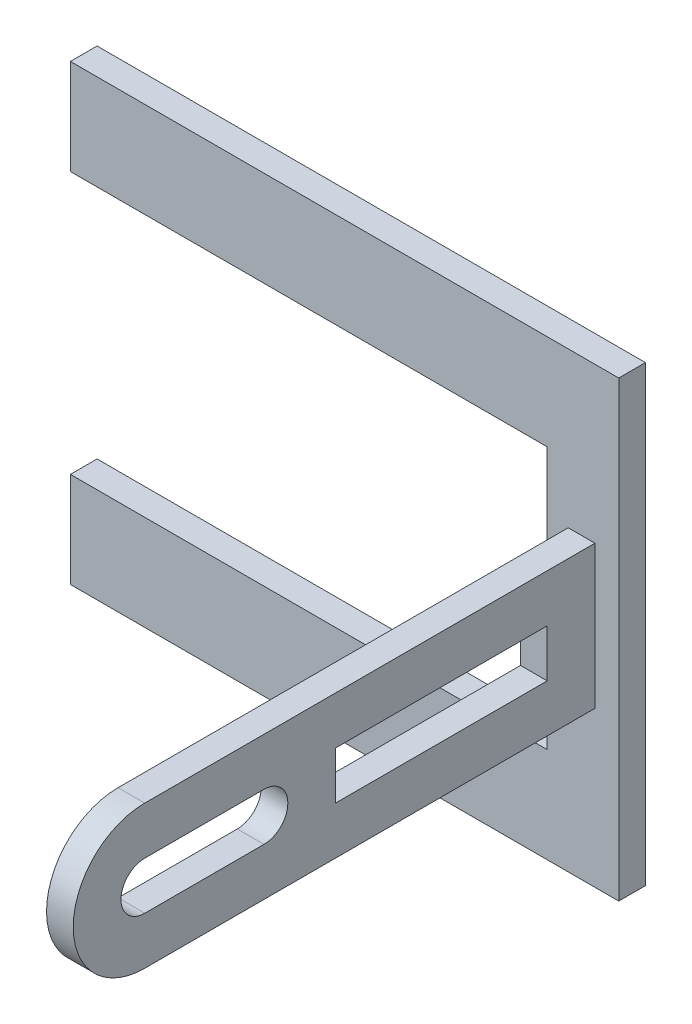
ISO-10303-21;
HEADER;
FILE_DESCRIPTION(('STEP AP214'),'2;1');
FILE_NAME('part.step','',(''),(''),'','','');
FILE_SCHEMA(('AUTOMOTIVE_DESIGN { 1 0 10303 214 1 1 1 1 }'));
ENDSEC;
DATA;
#1=APPLICATION_CONTEXT('core data for automotive mechanical design processes');
#2=APPLICATION_PROTOCOL_DEFINITION('international standard','automotive_design',2000,#1);
#3=PRODUCT_CONTEXT('',#1,'mechanical');
#4=PRODUCT('Part','Part','',(#3));
#5=PRODUCT_RELATED_PRODUCT_CATEGORY('part','',(#4));
#6=PRODUCT_DEFINITION_FORMATION('','',#4);
#7=PRODUCT_DEFINITION_CONTEXT('part definition',#1,'design');
#8=PRODUCT_DEFINITION('design','',#6,#7);
#9=PRODUCT_DEFINITION_SHAPE('','',#8);
#10=(LENGTH_UNIT() NAMED_UNIT(*) SI_UNIT(.MILLI.,.METRE.));
#11=(NAMED_UNIT(*) PLANE_ANGLE_UNIT() SI_UNIT($,.RADIAN.));
#12=(NAMED_UNIT(*) SI_UNIT($,.STERADIAN.) SOLID_ANGLE_UNIT());
#13=UNCERTAINTY_MEASURE_WITH_UNIT(LENGTH_MEASURE(1.E-05),#10,'distance_accuracy_value','');
#14=(GEOMETRIC_REPRESENTATION_CONTEXT(3) GLOBAL_UNCERTAINTY_ASSIGNED_CONTEXT((#13)) GLOBAL_UNIT_ASSIGNED_CONTEXT((#10,
#11,#12)) REPRESENTATION_CONTEXT('',''));
#15=CARTESIAN_POINT('',(0.,0.,0.));
#16=DIRECTION('',(0.,0.,1.));
#17=DIRECTION('',(1.,0.,0.));
#18=AXIS2_PLACEMENT_3D('',#15,#16,#17);
#19=CARTESIAN_POINT('',(0.,0.,2.8));
#20=DIRECTION('',(0.,0.,-1.));
#21=DIRECTION('',(-1.,0.,0.));
#22=AXIS2_PLACEMENT_3D('',#19,#20,#21);
#23=PLANE('',#22);
#24=DIRECTION('',(0.,-1.,0.));
#25=VECTOR('',#24,1.);
#26=CARTESIAN_POINT('',(-25.,-23.75,2.8));
#27=LINE('',#26,#25);
#28=CARTESIAN_POINT('',(-25.,-13.75,2.8));
#29=VERTEX_POINT('',#28);
#30=CARTESIAN_POINT('',(-25.,-23.75,2.8));
#31=VERTEX_POINT('',#30);
#32=EDGE_CURVE('E157',#29,#31,#27,.T.);
#33=ORIENTED_EDGE('',*,*,#32,.T.);
#34=DIRECTION('',(1.,0.,0.));
#35=VECTOR('',#34,1.);
#36=CARTESIAN_POINT('',(32.5,-23.75,2.8));
#37=LINE('',#36,#35);
#38=CARTESIAN_POINT('',(32.5,-23.75,2.8));
#39=VERTEX_POINT('',#38);
#40=EDGE_CURVE('E98',#31,#39,#37,.T.);
#41=ORIENTED_EDGE('',*,*,#40,.T.);
#42=DIRECTION('',(0.,1.,0.));
#43=VECTOR('',#42,1.);
#44=CARTESIAN_POINT('',(32.5,23.75,2.8));
#45=LINE('',#44,#43);
#46=CARTESIAN_POINT('',(32.5,23.75,2.8));
#47=VERTEX_POINT('',#46);
#48=EDGE_CURVE('E172',#39,#47,#45,.T.);
#49=ORIENTED_EDGE('',*,*,#48,.T.);
#50=DIRECTION('',(-1.,0.,0.));
#51=VECTOR('',#50,1.);
#52=CARTESIAN_POINT('',(-25.,23.75,2.8));
#53=LINE('',#52,#51);
#54=CARTESIAN_POINT('',(-25.,23.75,2.8));
#55=VERTEX_POINT('',#54);
#56=EDGE_CURVE('E184',#47,#55,#53,.T.);
#57=ORIENTED_EDGE('',*,*,#56,.T.);
#58=DIRECTION('',(0.,-1.,0.));
#59=VECTOR('',#58,1.);
#60=CARTESIAN_POINT('',(-25.,13.75,2.8));
#61=LINE('',#60,#59);
#62=CARTESIAN_POINT('',(-25.,13.75,2.8));
#63=VERTEX_POINT('',#62);
#64=EDGE_CURVE('E120',#55,#63,#61,.T.);
#65=ORIENTED_EDGE('',*,*,#64,.T.);
#66=DIRECTION('',(1.,0.,0.));
#67=VECTOR('',#66,1.);
#68=CARTESIAN_POINT('',(25.,13.75,2.8));
#69=LINE('',#68,#67);
#70=CARTESIAN_POINT('',(25.,13.75,2.8));
#71=VERTEX_POINT('',#70);
#72=EDGE_CURVE('E113',#63,#71,#69,.T.);
#73=ORIENTED_EDGE('',*,*,#72,.T.);
#74=DIRECTION('',(0.,-1.,0.));
#75=VECTOR('',#74,1.);
#76=CARTESIAN_POINT('',(25.,-13.75,2.8));
#77=LINE('',#76,#75);
#78=CARTESIAN_POINT('',(25.,-13.75,2.8));
#79=VERTEX_POINT('',#78);
#80=EDGE_CURVE('E117',#71,#79,#77,.T.);
#81=ORIENTED_EDGE('',*,*,#80,.T.);
#82=DIRECTION('',(-1.,0.,0.));
#83=VECTOR('',#82,1.);
#84=CARTESIAN_POINT('',(-25.,-13.75,2.8));
#85=LINE('',#84,#83);
#86=EDGE_CURVE('E57',#79,#29,#85,.T.);
#87=ORIENTED_EDGE('',*,*,#86,.T.);
#88=EDGE_LOOP('',(#33,#41,#49,#57,#65,#73,#81,#87));
#89=FACE_BOUND('',#88,.T.);
#90=DIRECTION('',(0.,1.,0.));
#91=VECTOR('',#90,1.);
#92=CARTESIAN_POINT('',(27.2,-7.50000000000001,2.8));
#93=LINE('',#92,#91);
#94=CARTESIAN_POINT('',(27.2,-7.50000000000001,2.8));
#95=VERTEX_POINT('',#94);
#96=CARTESIAN_POINT('',(27.2,7.50000000000001,2.8));
#97=VERTEX_POINT('',#96);
#98=EDGE_CURVE('E216',#95,#97,#93,.T.);
#99=ORIENTED_EDGE('',*,*,#98,.T.);
#100=DIRECTION('',(1.,0.,0.));
#101=VECTOR('',#100,1.);
#102=CARTESIAN_POINT('',(27.2,7.50000000000001,2.8));
#103=LINE('',#102,#101);
#104=CARTESIAN_POINT('',(30.,7.50000000000001,2.8));
#105=VERTEX_POINT('',#104);
#106=EDGE_CURVE('E192',#97,#105,#103,.T.);
#107=ORIENTED_EDGE('',*,*,#106,.T.);
#108=DIRECTION('',(0.,1.,0.));
#109=VECTOR('',#108,1.);
#110=CARTESIAN_POINT('',(30.,-7.50000000000001,2.8));
#111=LINE('',#110,#109);
#112=CARTESIAN_POINT('',(30.,-7.50000000000001,2.8));
#113=VERTEX_POINT('',#112);
#114=EDGE_CURVE('E207',#113,#105,#111,.T.);
#115=ORIENTED_EDGE('',*,*,#114,.F.);
#116=DIRECTION('',(1.,0.,0.));
#117=VECTOR('',#116,1.);
#118=CARTESIAN_POINT('',(27.2,-7.50000000000001,2.8));
#119=LINE('',#118,#117);
#120=EDGE_CURVE('E190',#95,#113,#119,.T.);
#121=ORIENTED_EDGE('',*,*,#120,.F.);
#122=EDGE_LOOP('',(#99,#107,#115,#121));
#123=FACE_BOUND('',#122,.T.);
#124=ADVANCED_FACE('F33',(#89,#123),#23,.F.);
#125=CARTESIAN_POINT('',(-25.,-23.75,2.8));
#126=DIRECTION('',(1.,0.,0.));
#127=DIRECTION('',(0.,0.,-1.));
#128=AXIS2_PLACEMENT_3D('',#125,#126,#127);
#129=PLANE('',#128);
#130=DIRECTION('',(0.,-1.,0.));
#131=VECTOR('',#130,1.);
#132=CARTESIAN_POINT('',(-25.,-23.75,0.));
#133=LINE('',#132,#131);
#134=CARTESIAN_POINT('',(-25.,-13.75,0.));
#135=VERTEX_POINT('',#134);
#136=CARTESIAN_POINT('',(-25.,-23.75,0.));
#137=VERTEX_POINT('',#136);
#138=EDGE_CURVE('E141',#135,#137,#133,.T.);
#139=ORIENTED_EDGE('',*,*,#138,.T.);
#140=DIRECTION('',(0.,0.,-1.));
#141=VECTOR('',#140,1.);
#142=CARTESIAN_POINT('',(-25.,-23.75,2.8));
#143=LINE('',#142,#141);
#144=EDGE_CURVE('E11',#31,#137,#143,.T.);
#145=ORIENTED_EDGE('',*,*,#144,.F.);
#146=ORIENTED_EDGE('',*,*,#32,.F.);
#147=DIRECTION('',(0.,0.,-1.));
#148=VECTOR('',#147,1.);
#149=CARTESIAN_POINT('',(-25.,-13.75,2.8));
#150=LINE('',#149,#148);
#151=EDGE_CURVE('E137',#29,#135,#150,.T.);
#152=ORIENTED_EDGE('',*,*,#151,.T.);
#153=EDGE_LOOP('',(#139,#145,#146,#152));
#154=FACE_BOUND('',#153,.T.);
#155=ADVANCED_FACE('F35',(#154),#129,.F.);
#156=CARTESIAN_POINT('',(32.5,-23.75,2.8));
#157=DIRECTION('',(0.,1.,0.));
#158=DIRECTION('',(-1.,0.,0.));
#159=AXIS2_PLACEMENT_3D('',#156,#157,#158);
#160=PLANE('',#159);
#161=DIRECTION('',(1.,0.,0.));
#162=VECTOR('',#161,1.);
#163=CARTESIAN_POINT('',(32.5,-23.75,0.));
#164=LINE('',#163,#162);
#165=CARTESIAN_POINT('',(32.5,-23.75,0.));
#166=VERTEX_POINT('',#165);
#167=EDGE_CURVE('E144',#137,#166,#164,.T.);
#168=ORIENTED_EDGE('',*,*,#167,.T.);
#169=DIRECTION('',(0.,0.,-1.));
#170=VECTOR('',#169,1.);
#171=CARTESIAN_POINT('',(32.5,-23.75,2.8));
#172=LINE('',#171,#170);
#173=EDGE_CURVE('E41',#39,#166,#172,.T.);
#174=ORIENTED_EDGE('',*,*,#173,.F.);
#175=ORIENTED_EDGE('',*,*,#40,.F.);
#176=ORIENTED_EDGE('',*,*,#144,.T.);
#177=EDGE_LOOP('',(#168,#174,#175,#176));
#178=FACE_BOUND('',#177,.T.);
#179=ADVANCED_FACE('F383',(#178),#160,.F.);
#180=CARTESIAN_POINT('',(32.5,23.75,2.8));
#181=DIRECTION('',(-1.,0.,0.));
#182=DIRECTION('',(0.,-1.,0.));
#183=AXIS2_PLACEMENT_3D('',#180,#181,#182);
#184=PLANE('',#183);
#185=DIRECTION('',(0.,1.,0.));
#186=VECTOR('',#185,1.);
#187=CARTESIAN_POINT('',(32.5,23.75,0.));
#188=LINE('',#187,#186);
#189=CARTESIAN_POINT('',(32.5,23.75,0.));
#190=VERTEX_POINT('',#189);
#191=EDGE_CURVE('E147',#166,#190,#188,.T.);
#192=ORIENTED_EDGE('',*,*,#191,.T.);
#193=DIRECTION('',(0.,0.,-1.));
#194=VECTOR('',#193,1.);
#195=CARTESIAN_POINT('',(32.5,23.75,2.8));
#196=LINE('',#195,#194);
#197=EDGE_CURVE('E164',#47,#190,#196,.T.);
#198=ORIENTED_EDGE('',*,*,#197,.F.);
#199=ORIENTED_EDGE('',*,*,#48,.F.);
#200=ORIENTED_EDGE('',*,*,#173,.T.);
#201=EDGE_LOOP('',(#192,#198,#199,#200));
#202=FACE_BOUND('',#201,.T.);
#203=ADVANCED_FACE('F170',(#202),#184,.F.);
#204=CARTESIAN_POINT('',(-25.,23.75,2.8));
#205=DIRECTION('',(0.,-1.,0.));
#206=DIRECTION('',(0.,0.,-1.));
#207=AXIS2_PLACEMENT_3D('',#204,#205,#206);
#208=PLANE('',#207);
#209=DIRECTION('',(-1.,0.,0.));
#210=VECTOR('',#209,1.);
#211=CARTESIAN_POINT('',(-25.,23.75,0.));
#212=LINE('',#211,#210);
#213=CARTESIAN_POINT('',(-25.,23.75,0.));
#214=VERTEX_POINT('',#213);
#215=EDGE_CURVE('E149',#190,#214,#212,.T.);
#216=ORIENTED_EDGE('',*,*,#215,.T.);
#217=DIRECTION('',(0.,0.,-1.));
#218=VECTOR('',#217,1.);
#219=CARTESIAN_POINT('',(-25.,23.75,2.8));
#220=LINE('',#219,#218);
#221=EDGE_CURVE('E161',#55,#214,#220,.T.);
#222=ORIENTED_EDGE('',*,*,#221,.F.);
#223=ORIENTED_EDGE('',*,*,#56,.F.);
#224=ORIENTED_EDGE('',*,*,#197,.T.);
#225=EDGE_LOOP('',(#216,#222,#223,#224));
#226=FACE_BOUND('',#225,.T.);
#227=ADVANCED_FACE('F180',(#226),#208,.F.);
#228=CARTESIAN_POINT('',(-25.,13.75,2.8));
#229=DIRECTION('',(1.,0.,0.));
#230=DIRECTION('',(0.,0.,-1.));
#231=AXIS2_PLACEMENT_3D('',#228,#229,#230);
#232=PLANE('',#231);
#233=DIRECTION('',(0.,-1.,0.));
#234=VECTOR('',#233,1.);
#235=CARTESIAN_POINT('',(-25.,13.75,0.));
#236=LINE('',#235,#234);
#237=CARTESIAN_POINT('',(-25.,13.75,0.));
#238=VERTEX_POINT('',#237);
#239=EDGE_CURVE('E151',#214,#238,#236,.T.);
#240=ORIENTED_EDGE('',*,*,#239,.T.);
#241=DIRECTION('',(0.,0.,-1.));
#242=VECTOR('',#241,1.);
#243=CARTESIAN_POINT('',(-25.,13.75,2.8));
#244=LINE('',#243,#242);
#245=EDGE_CURVE('E132',#63,#238,#244,.T.);
#246=ORIENTED_EDGE('',*,*,#245,.F.);
#247=ORIENTED_EDGE('',*,*,#64,.F.);
#248=ORIENTED_EDGE('',*,*,#221,.T.);
#249=EDGE_LOOP('',(#240,#246,#247,#248));
#250=FACE_BOUND('',#249,.T.);
#251=ADVANCED_FACE('F183',(#250),#232,.F.);
#252=CARTESIAN_POINT('',(25.,13.75,2.8));
#253=DIRECTION('',(0.,1.,0.));
#254=DIRECTION('',(0.,0.,1.));
#255=AXIS2_PLACEMENT_3D('',#252,#253,#254);
#256=PLANE('',#255);
#257=DIRECTION('',(1.,0.,0.));
#258=VECTOR('',#257,1.);
#259=CARTESIAN_POINT('',(25.,13.75,0.));
#260=LINE('',#259,#258);
#261=CARTESIAN_POINT('',(25.,13.75,0.));
#262=VERTEX_POINT('',#261);
#263=EDGE_CURVE('E129',#238,#262,#260,.T.);
#264=ORIENTED_EDGE('',*,*,#263,.T.);
#265=DIRECTION('',(0.,0.,-1.));
#266=VECTOR('',#265,1.);
#267=CARTESIAN_POINT('',(25.,13.75,2.8));
#268=LINE('',#267,#266);
#269=EDGE_CURVE('E126',#71,#262,#268,.T.);
#270=ORIENTED_EDGE('',*,*,#269,.F.);
#271=ORIENTED_EDGE('',*,*,#72,.F.);
#272=ORIENTED_EDGE('',*,*,#245,.T.);
#273=EDGE_LOOP('',(#264,#270,#271,#272));
#274=FACE_BOUND('',#273,.T.);
#275=ADVANCED_FACE('F127',(#274),#256,.F.);
#276=CARTESIAN_POINT('',(25.,-13.75,2.8));
#277=DIRECTION('',(1.,0.,0.));
#278=DIRECTION('',(0.,0.,-1.));
#279=AXIS2_PLACEMENT_3D('',#276,#277,#278);
#280=PLANE('',#279);
#281=DIRECTION('',(0.,-1.,0.));
#282=VECTOR('',#281,1.);
#283=CARTESIAN_POINT('',(25.,-13.75,0.));
#284=LINE('',#283,#282);
#285=CARTESIAN_POINT('',(25.,-13.75,0.));
#286=VERTEX_POINT('',#285);
#287=EDGE_CURVE('E154',#262,#286,#284,.T.);
#288=ORIENTED_EDGE('',*,*,#287,.T.);
#289=DIRECTION('',(0.,0.,-1.));
#290=VECTOR('',#289,1.);
#291=CARTESIAN_POINT('',(25.,-13.75,2.8));
#292=LINE('',#291,#290);
#293=EDGE_CURVE('E133',#79,#286,#292,.T.);
#294=ORIENTED_EDGE('',*,*,#293,.F.);
#295=ORIENTED_EDGE('',*,*,#80,.F.);
#296=ORIENTED_EDGE('',*,*,#269,.T.);
#297=EDGE_LOOP('',(#288,#294,#295,#296));
#298=FACE_BOUND('',#297,.T.);
#299=ADVANCED_FACE('F135',(#298),#280,.F.);
#300=CARTESIAN_POINT('',(-25.,-13.75,2.8));
#301=DIRECTION('',(0.,-1.,0.));
#302=DIRECTION('',(0.,0.,-1.));
#303=AXIS2_PLACEMENT_3D('',#300,#301,#302);
#304=PLANE('',#303);
#305=DIRECTION('',(-1.,0.,0.));
#306=VECTOR('',#305,1.);
#307=CARTESIAN_POINT('',(-25.,-13.75,0.));
#308=LINE('',#307,#306);
#309=EDGE_CURVE('E90',#286,#135,#308,.T.);
#310=ORIENTED_EDGE('',*,*,#309,.T.);
#311=ORIENTED_EDGE('',*,*,#151,.F.);
#312=ORIENTED_EDGE('',*,*,#86,.F.);
#313=ORIENTED_EDGE('',*,*,#293,.T.);
#314=EDGE_LOOP('',(#310,#311,#312,#313));
#315=FACE_BOUND('',#314,.T.);
#316=ADVANCED_FACE('F391',(#315),#304,.F.);
#317=CARTESIAN_POINT('',(0.,0.,0.));
#318=DIRECTION('',(0.,0.,-1.));
#319=DIRECTION('',(-1.,0.,0.));
#320=AXIS2_PLACEMENT_3D('',#317,#318,#319);
#321=PLANE('',#320);
#322=ORIENTED_EDGE('',*,*,#138,.F.);
#323=ORIENTED_EDGE('',*,*,#309,.F.);
#324=ORIENTED_EDGE('',*,*,#287,.F.);
#325=ORIENTED_EDGE('',*,*,#263,.F.);
#326=ORIENTED_EDGE('',*,*,#239,.F.);
#327=ORIENTED_EDGE('',*,*,#215,.F.);
#328=ORIENTED_EDGE('',*,*,#191,.F.);
#329=ORIENTED_EDGE('',*,*,#167,.F.);
#330=EDGE_LOOP('',(#322,#323,#324,#325,#326,#327,#328,#329));
#331=FACE_BOUND('',#330,.T.);
#332=ADVANCED_FACE('F176',(#331),#321,.T.);
#333=CARTESIAN_POINT('',(27.2,-7.49999999999999,50.));
#334=DIRECTION('',(0.,-1.,0.));
#335=DIRECTION('',(0.,0.,-1.));
#336=AXIS2_PLACEMENT_3D('',#333,#334,#335);
#337=PLANE('',#336);
#338=DIRECTION('',(0.,0.,-1.));
#339=VECTOR('',#338,1.);
#340=CARTESIAN_POINT('',(30.,-7.49999999999999,50.));
#341=LINE('',#340,#339);
#342=CARTESIAN_POINT('',(30.,-7.49999999999999,50.));
#343=VERTEX_POINT('',#342);
#344=EDGE_CURVE('E48',#343,#113,#341,.T.);
#345=ORIENTED_EDGE('',*,*,#344,.F.);
#346=DIRECTION('',(1.,0.,0.));
#347=VECTOR('',#346,1.);
#348=CARTESIAN_POINT('',(27.2,-7.49999999999999,50.));
#349=LINE('',#348,#347);
#350=CARTESIAN_POINT('',(27.2,-7.49999999999999,50.));
#351=VERTEX_POINT('',#350);
#352=EDGE_CURVE('E145',#351,#343,#349,.T.);
#353=ORIENTED_EDGE('',*,*,#352,.F.);
#354=DIRECTION('',(0.,0.,-1.));
#355=VECTOR('',#354,1.);
#356=CARTESIAN_POINT('',(27.2,-7.49999999999999,50.));
#357=LINE('',#356,#355);
#358=EDGE_CURVE('E203',#351,#95,#357,.T.);
#359=ORIENTED_EDGE('',*,*,#358,.T.);
#360=ORIENTED_EDGE('',*,*,#120,.T.);
#361=EDGE_LOOP('',(#345,#353,#359,#360));
#362=FACE_BOUND('',#361,.T.);
#363=ADVANCED_FACE('F387',(#362),#337,.T.);
#364=CARTESIAN_POINT('',(27.2,0.,50.));
#365=DIRECTION('',(1.,0.,0.));
#366=DIRECTION('',(0.,0.,-1.));
#367=AXIS2_PLACEMENT_3D('',#364,#365,#366);
#368=CYLINDRICAL_SURFACE('',#367,7.49999999999999);
#369=CARTESIAN_POINT('',(30.,0.,50.));
#370=DIRECTION('',(1.,0.,0.));
#371=DIRECTION('',(0.,0.,-1.));
#372=AXIS2_PLACEMENT_3D('',#369,#370,#371);
#373=CIRCLE('',#372,7.49999999999999);
#374=CARTESIAN_POINT('',(30.,7.49999999999999,50.));
#375=VERTEX_POINT('',#374);
#376=EDGE_CURVE('E201',#375,#343,#373,.T.);
#377=ORIENTED_EDGE('',*,*,#376,.F.);
#378=DIRECTION('',(1.,0.,0.));
#379=VECTOR('',#378,1.);
#380=CARTESIAN_POINT('',(27.2,7.49999999999999,50.));
#381=LINE('',#380,#379);
#382=CARTESIAN_POINT('',(27.2,7.49999999999999,50.));
#383=VERTEX_POINT('',#382);
#384=EDGE_CURVE('E196',#383,#375,#381,.T.);
#385=ORIENTED_EDGE('',*,*,#384,.F.);
#386=CARTESIAN_POINT('',(27.2,0.,50.));
#387=DIRECTION('',(1.,0.,0.));
#388=DIRECTION('',(0.,0.,-1.));
#389=AXIS2_PLACEMENT_3D('',#386,#387,#388);
#390=CIRCLE('',#389,7.49999999999999);
#391=EDGE_CURVE('E193',#383,#351,#390,.T.);
#392=ORIENTED_EDGE('',*,*,#391,.T.);
#393=ORIENTED_EDGE('',*,*,#352,.T.);
#394=EDGE_LOOP('',(#377,#385,#392,#393));
#395=FACE_BOUND('',#394,.T.);
#396=ADVANCED_FACE('F444',(#395),#368,.T.);
#397=CARTESIAN_POINT('',(27.2,7.50000000000001,2.8));
#398=DIRECTION('',(0.,1.,0.));
#399=DIRECTION('',(0.,0.,1.));
#400=AXIS2_PLACEMENT_3D('',#397,#398,#399);
#401=PLANE('',#400);
#402=DIRECTION('',(0.,0.,1.));
#403=VECTOR('',#402,1.);
#404=CARTESIAN_POINT('',(30.,7.50000000000001,2.8));
#405=LINE('',#404,#403);
#406=EDGE_CURVE('E204',#105,#375,#405,.T.);
#407=ORIENTED_EDGE('',*,*,#406,.F.);
#408=ORIENTED_EDGE('',*,*,#106,.F.);
#409=DIRECTION('',(0.,0.,1.));
#410=VECTOR('',#409,1.);
#411=CARTESIAN_POINT('',(27.2,7.50000000000001,2.8));
#412=LINE('',#411,#410);
#413=EDGE_CURVE('E213',#97,#383,#412,.T.);
#414=ORIENTED_EDGE('',*,*,#413,.T.);
#415=ORIENTED_EDGE('',*,*,#384,.T.);
#416=EDGE_LOOP('',(#407,#408,#414,#415));
#417=FACE_BOUND('',#416,.T.);
#418=ADVANCED_FACE('F451',(#417),#401,.T.);
#419=CARTESIAN_POINT('',(27.2,0.,50.));
#420=DIRECTION('',(1.,0.,0.));
#421=DIRECTION('',(0.,0.,-1.));
#422=AXIS2_PLACEMENT_3D('',#419,#420,#421);
#423=PLANE('',#422);
#424=DIRECTION('',(0.,-1.,0.));
#425=VECTOR('',#424,1.);
#426=CARTESIAN_POINT('',(27.2,2.5,30.));
#427=LINE('',#426,#425);
#428=CARTESIAN_POINT('',(27.2,2.5,30.));
#429=VERTEX_POINT('',#428);
#430=CARTESIAN_POINT('',(27.2,-2.5,30.));
#431=VERTEX_POINT('',#430);
#432=EDGE_CURVE('E261',#429,#431,#427,.T.);
#433=ORIENTED_EDGE('',*,*,#432,.T.);
#434=DIRECTION('',(0.,0.,-1.));
#435=VECTOR('',#434,1.);
#436=CARTESIAN_POINT('',(27.2,-2.5,30.));
#437=LINE('',#436,#435);
#438=CARTESIAN_POINT('',(27.2,-2.5,7.8));
#439=VERTEX_POINT('',#438);
#440=EDGE_CURVE('E272',#431,#439,#437,.T.);
#441=ORIENTED_EDGE('',*,*,#440,.T.);
#442=DIRECTION('',(0.,1.,0.));
#443=VECTOR('',#442,1.);
#444=CARTESIAN_POINT('',(27.2,-2.5,7.8));
#445=LINE('',#444,#443);
#446=CARTESIAN_POINT('',(27.2,2.50000000000001,7.8));
#447=VERTEX_POINT('',#446);
#448=EDGE_CURVE('E287',#439,#447,#445,.T.);
#449=ORIENTED_EDGE('',*,*,#448,.T.);
#450=DIRECTION('',(0.,0.,1.));
#451=VECTOR('',#450,1.);
#452=CARTESIAN_POINT('',(27.2,2.50000000000001,7.8));
#453=LINE('',#452,#451);
#454=EDGE_CURVE('E284',#447,#429,#453,.T.);
#455=ORIENTED_EDGE('',*,*,#454,.T.);
#456=EDGE_LOOP('',(#433,#441,#449,#455));
#457=FACE_BOUND('',#456,.T.);
#458=DIRECTION('',(0.,0.,1.));
#459=VECTOR('',#458,1.);
#460=CARTESIAN_POINT('',(27.2,2.5,37.5));
#461=LINE('',#460,#459);
#462=CARTESIAN_POINT('',(27.2,2.5,37.5));
#463=VERTEX_POINT('',#462);
#464=CARTESIAN_POINT('',(27.2,2.5,50.));
#465=VERTEX_POINT('',#464);
#466=EDGE_CURVE('E225',#463,#465,#461,.T.);
#467=ORIENTED_EDGE('',*,*,#466,.T.);
#468=CARTESIAN_POINT('',(27.2,0.,50.));
#469=DIRECTION('',(1.,0.,0.));
#470=DIRECTION('',(0.,0.,-1.));
#471=AXIS2_PLACEMENT_3D('',#468,#469,#470);
#472=CIRCLE('',#471,2.5);
#473=CARTESIAN_POINT('',(27.2,-2.5,50.));
#474=VERTEX_POINT('',#473);
#475=EDGE_CURVE('E236',#465,#474,#472,.T.);
#476=ORIENTED_EDGE('',*,*,#475,.T.);
#477=DIRECTION('',(0.,0.,-1.));
#478=VECTOR('',#477,1.);
#479=CARTESIAN_POINT('',(27.2,-2.5,50.));
#480=LINE('',#479,#478);
#481=CARTESIAN_POINT('',(27.2,-2.5,37.5));
#482=VERTEX_POINT('',#481);
#483=EDGE_CURVE('E252',#474,#482,#480,.T.);
#484=ORIENTED_EDGE('',*,*,#483,.T.);
#485=CARTESIAN_POINT('',(27.2,0.,37.5));
#486=DIRECTION('',(1.,0.,0.));
#487=DIRECTION('',(0.,0.,1.));
#488=AXIS2_PLACEMENT_3D('',#485,#486,#487);
#489=CIRCLE('',#488,2.5);
#490=EDGE_CURVE('E249',#482,#463,#489,.T.);
#491=ORIENTED_EDGE('',*,*,#490,.T.);
#492=EDGE_LOOP('',(#467,#476,#484,#491));
#493=FACE_BOUND('',#492,.T.);
#494=ORIENTED_EDGE('',*,*,#358,.F.);
#495=ORIENTED_EDGE('',*,*,#391,.F.);
#496=ORIENTED_EDGE('',*,*,#413,.F.);
#497=ORIENTED_EDGE('',*,*,#98,.F.);
#498=EDGE_LOOP('',(#494,#495,#496,#497));
#499=FACE_BOUND('',#498,.T.);
#500=ADVANCED_FACE('F294',(#457,#493,#499),#423,.F.);
#501=CARTESIAN_POINT('',(30.,0.,50.));
#502=DIRECTION('',(1.,0.,0.));
#503=DIRECTION('',(0.,0.,-1.));
#504=AXIS2_PLACEMENT_3D('',#501,#502,#503);
#505=PLANE('',#504);
#506=DIRECTION('',(0.,0.,-1.));
#507=VECTOR('',#506,1.);
#508=CARTESIAN_POINT('',(30.,-2.5,30.));
#509=LINE('',#508,#507);
#510=CARTESIAN_POINT('',(30.,-2.5,30.));
#511=VERTEX_POINT('',#510);
#512=CARTESIAN_POINT('',(30.,-2.5,7.8));
#513=VERTEX_POINT('',#512);
#514=EDGE_CURVE('E279',#511,#513,#509,.T.);
#515=ORIENTED_EDGE('',*,*,#514,.F.);
#516=DIRECTION('',(0.,-1.,0.));
#517=VECTOR('',#516,1.);
#518=CARTESIAN_POINT('',(30.,2.5,30.));
#519=LINE('',#518,#517);
#520=CARTESIAN_POINT('',(30.,2.5,30.));
#521=VERTEX_POINT('',#520);
#522=EDGE_CURVE('E269',#521,#511,#519,.T.);
#523=ORIENTED_EDGE('',*,*,#522,.F.);
#524=DIRECTION('',(0.,0.,1.));
#525=VECTOR('',#524,1.);
#526=CARTESIAN_POINT('',(30.,2.50000000000001,7.8));
#527=LINE('',#526,#525);
#528=CARTESIAN_POINT('',(30.,2.50000000000001,7.8));
#529=VERTEX_POINT('',#528);
#530=EDGE_CURVE('E273',#529,#521,#527,.T.);
#531=ORIENTED_EDGE('',*,*,#530,.F.);
#532=DIRECTION('',(0.,1.,0.));
#533=VECTOR('',#532,1.);
#534=CARTESIAN_POINT('',(30.,-2.5,7.8));
#535=LINE('',#534,#533);
#536=EDGE_CURVE('E276',#513,#529,#535,.T.);
#537=ORIENTED_EDGE('',*,*,#536,.F.);
#538=EDGE_LOOP('',(#515,#523,#531,#537));
#539=FACE_BOUND('',#538,.T.);
#540=CARTESIAN_POINT('',(30.,0.,50.));
#541=DIRECTION('',(1.,0.,0.));
#542=DIRECTION('',(0.,0.,-1.));
#543=AXIS2_PLACEMENT_3D('',#540,#541,#542);
#544=CIRCLE('',#543,2.5);
#545=CARTESIAN_POINT('',(30.,2.5,50.));
#546=VERTEX_POINT('',#545);
#547=CARTESIAN_POINT('',(30.,-2.5,50.));
#548=VERTEX_POINT('',#547);
#549=EDGE_CURVE('E243',#546,#548,#544,.T.);
#550=ORIENTED_EDGE('',*,*,#549,.F.);
#551=DIRECTION('',(0.,0.,1.));
#552=VECTOR('',#551,1.);
#553=CARTESIAN_POINT('',(30.,2.5,37.5));
#554=LINE('',#553,#552);
#555=CARTESIAN_POINT('',(30.,2.5,37.5));
#556=VERTEX_POINT('',#555);
#557=EDGE_CURVE('E233',#556,#546,#554,.T.);
#558=ORIENTED_EDGE('',*,*,#557,.F.);
#559=CARTESIAN_POINT('',(30.,0.,37.5));
#560=DIRECTION('',(1.,0.,0.));
#561=DIRECTION('',(0.,0.,1.));
#562=AXIS2_PLACEMENT_3D('',#559,#560,#561);
#563=CIRCLE('',#562,2.5);
#564=CARTESIAN_POINT('',(30.,-2.5,37.5));
#565=VERTEX_POINT('',#564);
#566=EDGE_CURVE('E237',#565,#556,#563,.T.);
#567=ORIENTED_EDGE('',*,*,#566,.F.);
#568=DIRECTION('',(0.,0.,-1.));
#569=VECTOR('',#568,1.);
#570=CARTESIAN_POINT('',(30.,-2.5,50.));
#571=LINE('',#570,#569);
#572=EDGE_CURVE('E240',#548,#565,#571,.T.);
#573=ORIENTED_EDGE('',*,*,#572,.F.);
#574=EDGE_LOOP('',(#550,#558,#567,#573));
#575=FACE_BOUND('',#574,.T.);
#576=ORIENTED_EDGE('',*,*,#344,.T.);
#577=ORIENTED_EDGE('',*,*,#114,.T.);
#578=ORIENTED_EDGE('',*,*,#406,.T.);
#579=ORIENTED_EDGE('',*,*,#376,.T.);
#580=EDGE_LOOP('',(#576,#577,#578,#579));
#581=FACE_BOUND('',#580,.T.);
#582=ADVANCED_FACE('F366',(#539,#575,#581),#505,.T.);
#583=CARTESIAN_POINT('',(27.2,0.,50.));
#584=DIRECTION('',(1.,0.,0.));
#585=DIRECTION('',(0.,0.,-1.));
#586=AXIS2_PLACEMENT_3D('',#583,#584,#585);
#587=CYLINDRICAL_SURFACE('',#586,2.5);
#588=ORIENTED_EDGE('',*,*,#549,.T.);
#589=DIRECTION('',(1.,0.,0.));
#590=VECTOR('',#589,1.);
#591=CARTESIAN_POINT('',(27.2,-2.5,50.));
#592=LINE('',#591,#590);
#593=EDGE_CURVE('E221',#474,#548,#592,.T.);
#594=ORIENTED_EDGE('',*,*,#593,.F.);
#595=ORIENTED_EDGE('',*,*,#475,.F.);
#596=DIRECTION('',(1.,0.,0.));
#597=VECTOR('',#596,1.);
#598=CARTESIAN_POINT('',(27.2,2.5,50.));
#599=LINE('',#598,#597);
#600=EDGE_CURVE('E210',#465,#546,#599,.T.);
#601=ORIENTED_EDGE('',*,*,#600,.T.);
#602=EDGE_LOOP('',(#588,#594,#595,#601));
#603=FACE_BOUND('',#602,.T.);
#604=ADVANCED_FACE('F471',(#603),#587,.F.);
#605=CARTESIAN_POINT('',(27.2,2.5,37.5));
#606=DIRECTION('',(0.,1.,0.));
#607=DIRECTION('',(0.,0.,1.));
#608=AXIS2_PLACEMENT_3D('',#605,#606,#607);
#609=PLANE('',#608);
#610=ORIENTED_EDGE('',*,*,#557,.T.);
#611=ORIENTED_EDGE('',*,*,#600,.F.);
#612=ORIENTED_EDGE('',*,*,#466,.F.);
#613=DIRECTION('',(1.,0.,0.));
#614=VECTOR('',#613,1.);
#615=CARTESIAN_POINT('',(27.2,2.5,37.5));
#616=LINE('',#615,#614);
#617=EDGE_CURVE('E228',#463,#556,#616,.T.);
#618=ORIENTED_EDGE('',*,*,#617,.T.);
#619=EDGE_LOOP('',(#610,#611,#612,#618));
#620=FACE_BOUND('',#619,.T.);
#621=ADVANCED_FACE('F478',(#620),#609,.F.);
#622=CARTESIAN_POINT('',(27.2,0.,37.5));
#623=DIRECTION('',(1.,0.,0.));
#624=DIRECTION('',(0.,0.,-1.));
#625=AXIS2_PLACEMENT_3D('',#622,#623,#624);
#626=CYLINDRICAL_SURFACE('',#625,2.5);
#627=ORIENTED_EDGE('',*,*,#566,.T.);
#628=ORIENTED_EDGE('',*,*,#617,.F.);
#629=ORIENTED_EDGE('',*,*,#490,.F.);
#630=DIRECTION('',(1.,0.,0.));
#631=VECTOR('',#630,1.);
#632=CARTESIAN_POINT('',(27.2,-2.5,37.5));
#633=LINE('',#632,#631);
#634=EDGE_CURVE('E224',#482,#565,#633,.T.);
#635=ORIENTED_EDGE('',*,*,#634,.T.);
#636=EDGE_LOOP('',(#627,#628,#629,#635));
#637=FACE_BOUND('',#636,.T.);
#638=ADVANCED_FACE('F486',(#637),#626,.F.);
#639=CARTESIAN_POINT('',(27.2,-2.5,50.));
#640=DIRECTION('',(0.,-1.,0.));
#641=DIRECTION('',(0.,0.,-1.));
#642=AXIS2_PLACEMENT_3D('',#639,#640,#641);
#643=PLANE('',#642);
#644=ORIENTED_EDGE('',*,*,#572,.T.);
#645=ORIENTED_EDGE('',*,*,#634,.F.);
#646=ORIENTED_EDGE('',*,*,#483,.F.);
#647=ORIENTED_EDGE('',*,*,#593,.T.);
#648=EDGE_LOOP('',(#644,#645,#646,#647));
#649=FACE_BOUND('',#648,.T.);
#650=ADVANCED_FACE('F376',(#649),#643,.F.);
#651=CARTESIAN_POINT('',(27.2,-2.5,30.));
#652=DIRECTION('',(0.,-1.,0.));
#653=DIRECTION('',(0.,0.,-1.));
#654=AXIS2_PLACEMENT_3D('',#651,#652,#653);
#655=PLANE('',#654);
#656=ORIENTED_EDGE('',*,*,#514,.T.);
#657=DIRECTION('',(1.,0.,0.));
#658=VECTOR('',#657,1.);
#659=CARTESIAN_POINT('',(27.2,-2.5,7.8));
#660=LINE('',#659,#658);
#661=EDGE_CURVE('E257',#439,#513,#660,.T.);
#662=ORIENTED_EDGE('',*,*,#661,.F.);
#663=ORIENTED_EDGE('',*,*,#440,.F.);
#664=DIRECTION('',(1.,0.,0.));
#665=VECTOR('',#664,1.);
#666=CARTESIAN_POINT('',(27.2,-2.5,30.));
#667=LINE('',#666,#665);
#668=EDGE_CURVE('E246',#431,#511,#667,.T.);
#669=ORIENTED_EDGE('',*,*,#668,.T.);
#670=EDGE_LOOP('',(#656,#662,#663,#669));
#671=FACE_BOUND('',#670,.T.);
#672=ADVANCED_FACE('F304',(#671),#655,.F.);
#673=CARTESIAN_POINT('',(27.2,2.5,30.));
#674=DIRECTION('',(0.,0.,1.));
#675=DIRECTION('',(1.,0.,0.));
#676=AXIS2_PLACEMENT_3D('',#673,#674,#675);
#677=PLANE('',#676);
#678=ORIENTED_EDGE('',*,*,#522,.T.);
#679=ORIENTED_EDGE('',*,*,#668,.F.);
#680=ORIENTED_EDGE('',*,*,#432,.F.);
#681=DIRECTION('',(1.,0.,0.));
#682=VECTOR('',#681,1.);
#683=CARTESIAN_POINT('',(27.2,2.5,30.));
#684=LINE('',#683,#682);
#685=EDGE_CURVE('E264',#429,#521,#684,.T.);
#686=ORIENTED_EDGE('',*,*,#685,.T.);
#687=EDGE_LOOP('',(#678,#679,#680,#686));
#688=FACE_BOUND('',#687,.T.);
#689=ADVANCED_FACE('F368',(#688),#677,.F.);
#690=CARTESIAN_POINT('',(27.2,2.50000000000001,7.8));
#691=DIRECTION('',(0.,1.,0.));
#692=DIRECTION('',(0.,0.,1.));
#693=AXIS2_PLACEMENT_3D('',#690,#691,#692);
#694=PLANE('',#693);
#695=ORIENTED_EDGE('',*,*,#530,.T.);
#696=ORIENTED_EDGE('',*,*,#685,.F.);
#697=ORIENTED_EDGE('',*,*,#454,.F.);
#698=DIRECTION('',(1.,0.,0.));
#699=VECTOR('',#698,1.);
#700=CARTESIAN_POINT('',(27.2,2.50000000000001,7.8));
#701=LINE('',#700,#699);
#702=EDGE_CURVE('E260',#447,#529,#701,.T.);
#703=ORIENTED_EDGE('',*,*,#702,.T.);
#704=EDGE_LOOP('',(#695,#696,#697,#703));
#705=FACE_BOUND('',#704,.T.);
#706=ADVANCED_FACE('F359',(#705),#694,.F.);
#707=CARTESIAN_POINT('',(27.2,-2.5,7.8));
#708=DIRECTION('',(0.,0.,-1.));
#709=DIRECTION('',(-1.,0.,0.));
#710=AXIS2_PLACEMENT_3D('',#707,#708,#709);
#711=PLANE('',#710);
#712=ORIENTED_EDGE('',*,*,#536,.T.);
#713=ORIENTED_EDGE('',*,*,#702,.F.);
#714=ORIENTED_EDGE('',*,*,#448,.F.);
#715=ORIENTED_EDGE('',*,*,#661,.T.);
#716=EDGE_LOOP('',(#712,#713,#714,#715));
#717=FACE_BOUND('',#716,.T.);
#718=ADVANCED_FACE('F361',(#717),#711,.F.);
#719=CLOSED_SHELL('',(#124,#155,#179,#203,#227,#251,#275,#299,#316,#332,#363,#396,#418,#500,
#582,#604,#621,#638,#650,#672,#689,#706,#718));
#720=MANIFOLD_SOLID_BREP('B2',#719);
#721=ADVANCED_BREP_SHAPE_REPRESENTATION('',(#18,#720),#14);
#722=SHAPE_DEFINITION_REPRESENTATION(#9,#721);
ENDSEC;
END-ISO-10303-21;
